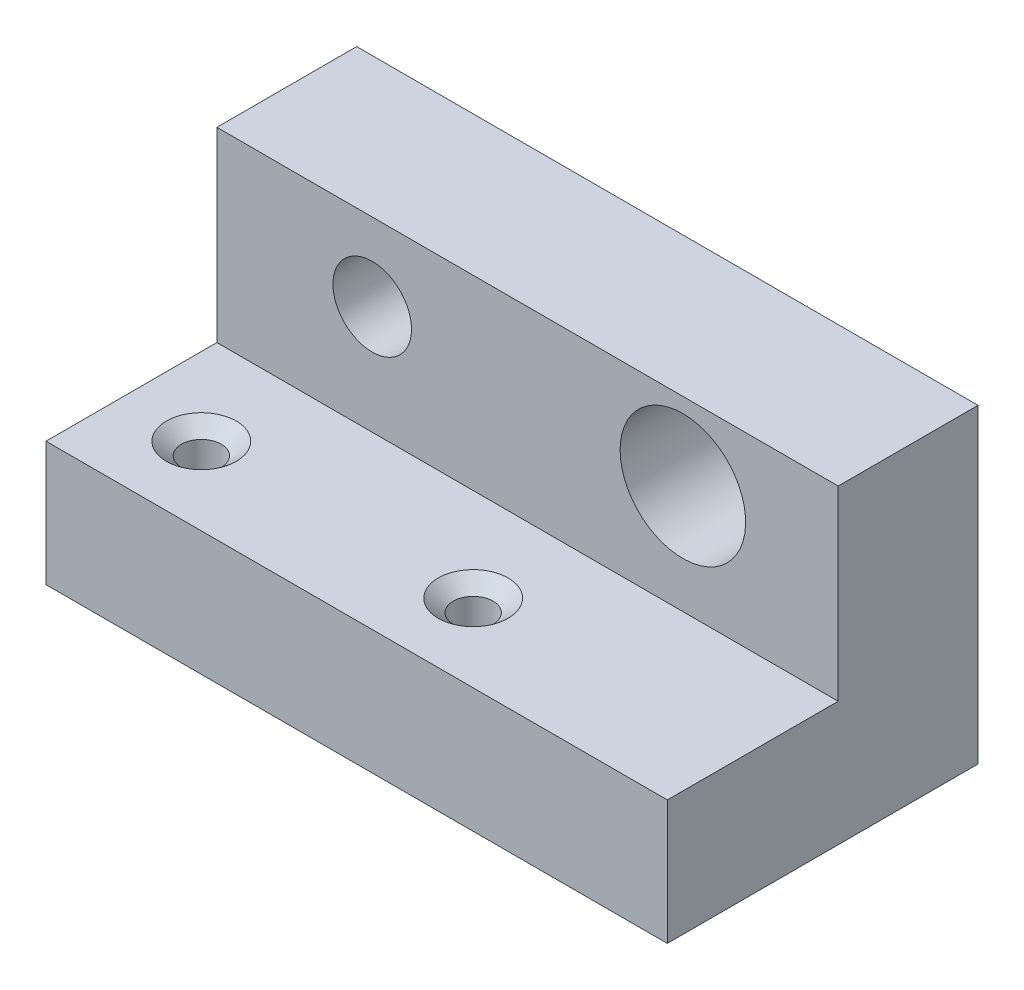
ISO-10303-21;
HEADER;
FILE_DESCRIPTION(('STEP AP214'),'2;1');
FILE_NAME('part.step','',(''),(''),'','','');
FILE_SCHEMA(('AUTOMOTIVE_DESIGN { 1 0 10303 214 1 1 1 1 }'));
ENDSEC;
DATA;
#1=APPLICATION_CONTEXT('core data for automotive mechanical design processes');
#2=APPLICATION_PROTOCOL_DEFINITION('international standard','automotive_design',2000,#1);
#3=PRODUCT_CONTEXT('',#1,'mechanical');
#4=PRODUCT('Part','Part','',(#3));
#5=PRODUCT_RELATED_PRODUCT_CATEGORY('part','',(#4));
#6=PRODUCT_DEFINITION_FORMATION('','',#4);
#7=PRODUCT_DEFINITION_CONTEXT('part definition',#1,'design');
#8=PRODUCT_DEFINITION('design','',#6,#7);
#9=PRODUCT_DEFINITION_SHAPE('','',#8);
#10=(LENGTH_UNIT() NAMED_UNIT(*) SI_UNIT(.MILLI.,.METRE.));
#11=(NAMED_UNIT(*) PLANE_ANGLE_UNIT() SI_UNIT($,.RADIAN.));
#12=(NAMED_UNIT(*) SI_UNIT($,.STERADIAN.) SOLID_ANGLE_UNIT());
#13=UNCERTAINTY_MEASURE_WITH_UNIT(LENGTH_MEASURE(1.E-05),#10,'distance_accuracy_value','');
#14=(GEOMETRIC_REPRESENTATION_CONTEXT(3) GLOBAL_UNCERTAINTY_ASSIGNED_CONTEXT((#13)) GLOBAL_UNIT_ASSIGNED_CONTEXT((#10,
#11,#12)) REPRESENTATION_CONTEXT('',''));
#15=CARTESIAN_POINT('',(0.,0.,0.));
#16=DIRECTION('',(0.,0.,1.));
#17=DIRECTION('',(1.,0.,0.));
#18=AXIS2_PLACEMENT_3D('',#15,#16,#17);
#19=CARTESIAN_POINT('',(50.8,0.,-25.4));
#20=DIRECTION('',(0.,1.,0.));
#21=DIRECTION('',(0.,0.,1.));
#22=AXIS2_PLACEMENT_3D('',#19,#20,#21);
#23=PLANE('',#22);
#24=CARTESIAN_POINT('',(6.35,0.,-6.34999999999999));
#25=DIRECTION('',(0.,1.,0.));
#26=DIRECTION('',(0.,0.,1.));
#27=AXIS2_PLACEMENT_3D('',#24,#25,#26);
#28=CIRCLE('',#27,1.63195);
#29=CARTESIAN_POINT('',(6.35,0.,-4.71805));
#30=VERTEX_POINT('',#29);
#31=EDGE_CURVE('E165',#30,#30,#28,.T.);
#32=ORIENTED_EDGE('',*,*,#31,.T.);
#33=EDGE_LOOP('',(#32));
#34=FACE_BOUND('',#33,.T.);
#35=CARTESIAN_POINT('',(28.575,0.,-6.34999999999999));
#36=DIRECTION('',(0.,1.,0.));
#37=DIRECTION('',(0.,0.,1.));
#38=AXIS2_PLACEMENT_3D('',#35,#36,#37);
#39=CIRCLE('',#38,1.63195);
#40=CARTESIAN_POINT('',(28.575,0.,-4.71805));
#41=VERTEX_POINT('',#40);
#42=EDGE_CURVE('E168',#41,#41,#39,.T.);
#43=ORIENTED_EDGE('',*,*,#42,.T.);
#44=EDGE_LOOP('',(#43));
#45=FACE_BOUND('',#44,.T.);
#46=DIRECTION('',(0.,0.,-1.));
#47=VECTOR('',#46,1.);
#48=CARTESIAN_POINT('',(0.,0.,-25.4));
#49=LINE('',#48,#47);
#50=CARTESIAN_POINT('',(0.,0.,0.));
#51=VERTEX_POINT('',#50);
#52=CARTESIAN_POINT('',(0.,0.,-25.4));
#53=VERTEX_POINT('',#52);
#54=EDGE_CURVE('E120',#51,#53,#49,.T.);
#55=ORIENTED_EDGE('',*,*,#54,.T.);
#56=DIRECTION('',(-1.,0.,0.));
#57=VECTOR('',#56,1.);
#58=CARTESIAN_POINT('',(50.8,0.,-25.4));
#59=LINE('',#58,#57);
#60=CARTESIAN_POINT('',(50.8,0.,-25.4));
#61=VERTEX_POINT('',#60);
#62=EDGE_CURVE('E11',#61,#53,#59,.T.);
#63=ORIENTED_EDGE('',*,*,#62,.F.);
#64=DIRECTION('',(0.,0.,-1.));
#65=VECTOR('',#64,1.);
#66=CARTESIAN_POINT('',(50.8,0.,-25.4));
#67=LINE('',#66,#65);
#68=CARTESIAN_POINT('',(50.8,0.,0.));
#69=VERTEX_POINT('',#68);
#70=EDGE_CURVE('E131',#69,#61,#67,.T.);
#71=ORIENTED_EDGE('',*,*,#70,.F.);
#72=DIRECTION('',(-1.,0.,0.));
#73=VECTOR('',#72,1.);
#74=CARTESIAN_POINT('',(50.8,0.,0.));
#75=LINE('',#74,#73);
#76=EDGE_CURVE('E116',#69,#51,#75,.T.);
#77=ORIENTED_EDGE('',*,*,#76,.T.);
#78=EDGE_LOOP('',(#55,#63,#71,#77));
#79=FACE_BOUND('',#78,.T.);
#80=ADVANCED_FACE('F36',(#34,#45,#79),#23,.F.);
#81=CARTESIAN_POINT('',(50.8,25.4,-25.4));
#82=DIRECTION('',(0.,0.,1.));
#83=DIRECTION('',(0.,-1.,0.));
#84=AXIS2_PLACEMENT_3D('',#81,#82,#83);
#85=PLANE('',#84);
#86=CARTESIAN_POINT('',(38.1,19.05,-25.4));
#87=DIRECTION('',(0.,0.,-1.));
#88=DIRECTION('',(0.,1.,0.));
#89=AXIS2_PLACEMENT_3D('',#86,#87,#88);
#90=CIRCLE('',#89,5.1308);
#91=CARTESIAN_POINT('',(38.1,24.1808,-25.4));
#92=VERTEX_POINT('',#91);
#93=EDGE_CURVE('E205',#92,#92,#90,.T.);
#94=ORIENTED_EDGE('',*,*,#93,.F.);
#95=EDGE_LOOP('',(#94));
#96=FACE_BOUND('',#95,.T.);
#97=CARTESIAN_POINT('',(12.7,19.05,-25.4));
#98=DIRECTION('',(0.,0.,1.));
#99=DIRECTION('',(1.,0.,0.));
#100=AXIS2_PLACEMENT_3D('',#97,#98,#99);
#101=CIRCLE('',#100,3.2131);
#102=CARTESIAN_POINT('',(15.9131,19.05,-25.4));
#103=VERTEX_POINT('',#102);
#104=EDGE_CURVE('E124',#103,#103,#101,.T.);
#105=ORIENTED_EDGE('',*,*,#104,.T.);
#106=EDGE_LOOP('',(#105));
#107=FACE_BOUND('',#106,.T.);
#108=DIRECTION('',(0.,1.,0.));
#109=VECTOR('',#108,1.);
#110=CARTESIAN_POINT('',(0.,25.4,-25.4));
#111=LINE('',#110,#109);
#112=CARTESIAN_POINT('',(0.,25.4,-25.4));
#113=VERTEX_POINT('',#112);
#114=EDGE_CURVE('E123',#53,#113,#111,.T.);
#115=ORIENTED_EDGE('',*,*,#114,.T.);
#116=DIRECTION('',(-1.,0.,0.));
#117=VECTOR('',#116,1.);
#118=CARTESIAN_POINT('',(50.8,25.4,-25.4));
#119=LINE('',#118,#117);
#120=CARTESIAN_POINT('',(50.8,25.4,-25.4));
#121=VERTEX_POINT('',#120);
#122=EDGE_CURVE('E44',#121,#113,#119,.T.);
#123=ORIENTED_EDGE('',*,*,#122,.F.);
#124=DIRECTION('',(0.,1.,0.));
#125=VECTOR('',#124,1.);
#126=CARTESIAN_POINT('',(50.8,25.4,-25.4));
#127=LINE('',#126,#125);
#128=EDGE_CURVE('E89',#61,#121,#127,.T.);
#129=ORIENTED_EDGE('',*,*,#128,.F.);
#130=ORIENTED_EDGE('',*,*,#62,.T.);
#131=EDGE_LOOP('',(#115,#123,#129,#130));
#132=FACE_BOUND('',#131,.T.);
#133=ADVANCED_FACE('F156',(#96,#107,#132),#85,.F.);
#134=CARTESIAN_POINT('',(50.8,25.4,-13.97));
#135=DIRECTION('',(0.,-1.,0.));
#136=DIRECTION('',(0.,0.,-1.));
#137=AXIS2_PLACEMENT_3D('',#134,#135,#136);
#138=PLANE('',#137);
#139=DIRECTION('',(0.,0.,1.));
#140=VECTOR('',#139,1.);
#141=CARTESIAN_POINT('',(0.,25.4,-13.97));
#142=LINE('',#141,#140);
#143=CARTESIAN_POINT('',(0.,25.4,-13.97));
#144=VERTEX_POINT('',#143);
#145=EDGE_CURVE('E126',#113,#144,#142,.T.);
#146=ORIENTED_EDGE('',*,*,#145,.T.);
#147=DIRECTION('',(-1.,0.,0.));
#148=VECTOR('',#147,1.);
#149=CARTESIAN_POINT('',(50.8,25.4,-13.97));
#150=LINE('',#149,#148);
#151=CARTESIAN_POINT('',(50.8,25.4,-13.97));
#152=VERTEX_POINT('',#151);
#153=EDGE_CURVE('E111',#152,#144,#150,.T.);
#154=ORIENTED_EDGE('',*,*,#153,.F.);
#155=DIRECTION('',(0.,0.,1.));
#156=VECTOR('',#155,1.);
#157=CARTESIAN_POINT('',(50.8,25.4,-13.97));
#158=LINE('',#157,#156);
#159=EDGE_CURVE('E102',#121,#152,#158,.T.);
#160=ORIENTED_EDGE('',*,*,#159,.F.);
#161=ORIENTED_EDGE('',*,*,#122,.T.);
#162=EDGE_LOOP('',(#146,#154,#160,#161));
#163=FACE_BOUND('',#162,.T.);
#164=ADVANCED_FACE('F137',(#163),#138,.F.);
#165=CARTESIAN_POINT('',(50.8,10.16,-13.97));
#166=DIRECTION('',(0.,0.,-1.));
#167=DIRECTION('',(-1.,0.,0.));
#168=AXIS2_PLACEMENT_3D('',#165,#166,#167);
#169=PLANE('',#168);
#170=CARTESIAN_POINT('',(38.1,19.05,-13.97));
#171=DIRECTION('',(0.,0.,-1.));
#172=DIRECTION('',(-1.,0.,0.));
#173=AXIS2_PLACEMENT_3D('',#170,#171,#172);
#174=CIRCLE('',#173,5.1308);
#175=CARTESIAN_POINT('',(32.9692,19.05,-13.97));
#176=VERTEX_POINT('',#175);
#177=EDGE_CURVE('E202',#176,#176,#174,.T.);
#178=ORIENTED_EDGE('',*,*,#177,.T.);
#179=EDGE_LOOP('',(#178));
#180=FACE_BOUND('',#179,.T.);
#181=CARTESIAN_POINT('',(12.7,19.05,-13.97));
#182=DIRECTION('',(0.,0.,1.));
#183=DIRECTION('',(1.,0.,0.));
#184=AXIS2_PLACEMENT_3D('',#181,#182,#183);
#185=CIRCLE('',#184,3.2131);
#186=CARTESIAN_POINT('',(15.9131,19.05,-13.97));
#187=VERTEX_POINT('',#186);
#188=EDGE_CURVE('E170',#187,#187,#185,.T.);
#189=ORIENTED_EDGE('',*,*,#188,.F.);
#190=EDGE_LOOP('',(#189));
#191=FACE_BOUND('',#190,.T.);
#192=DIRECTION('',(0.,-1.,0.));
#193=VECTOR('',#192,1.);
#194=CARTESIAN_POINT('',(0.,10.16,-13.97));
#195=LINE('',#194,#193);
#196=CARTESIAN_POINT('',(0.,10.16,-13.97));
#197=VERTEX_POINT('',#196);
#198=EDGE_CURVE('E110',#144,#197,#195,.T.);
#199=ORIENTED_EDGE('',*,*,#198,.T.);
#200=DIRECTION('',(-1.,0.,0.));
#201=VECTOR('',#200,1.);
#202=CARTESIAN_POINT('',(50.8,10.16,-13.97));
#203=LINE('',#202,#201);
#204=CARTESIAN_POINT('',(50.8,10.16,-13.97));
#205=VERTEX_POINT('',#204);
#206=EDGE_CURVE('E107',#205,#197,#203,.T.);
#207=ORIENTED_EDGE('',*,*,#206,.F.);
#208=DIRECTION('',(0.,-1.,0.));
#209=VECTOR('',#208,1.);
#210=CARTESIAN_POINT('',(50.8,10.16,-13.97));
#211=LINE('',#210,#209);
#212=EDGE_CURVE('E96',#152,#205,#211,.T.);
#213=ORIENTED_EDGE('',*,*,#212,.F.);
#214=ORIENTED_EDGE('',*,*,#153,.T.);
#215=EDGE_LOOP('',(#199,#207,#213,#214));
#216=FACE_BOUND('',#215,.T.);
#217=ADVANCED_FACE('F108',(#180,#191,#216),#169,.F.);
#218=CARTESIAN_POINT('',(50.8,10.16,0.));
#219=DIRECTION('',(0.,-1.,0.));
#220=DIRECTION('',(0.,0.,-1.));
#221=AXIS2_PLACEMENT_3D('',#218,#219,#220);
#222=PLANE('',#221);
#223=CARTESIAN_POINT('',(6.35,10.16,-6.34999999999999));
#224=DIRECTION('',(0.,1.,0.));
#225=DIRECTION('',(0.,0.,1.));
#226=AXIS2_PLACEMENT_3D('',#223,#224,#225);
#227=CIRCLE('',#226,2.8575);
#228=CARTESIAN_POINT('',(6.35,10.16,-3.4925));
#229=VERTEX_POINT('',#228);
#230=EDGE_CURVE('E204',#229,#229,#227,.T.);
#231=ORIENTED_EDGE('',*,*,#230,.F.);
#232=EDGE_LOOP('',(#231));
#233=FACE_BOUND('',#232,.T.);
#234=CARTESIAN_POINT('',(28.575,10.16,-6.34999999999999));
#235=DIRECTION('',(0.,1.,0.));
#236=DIRECTION('',(0.,0.,1.));
#237=AXIS2_PLACEMENT_3D('',#234,#235,#236);
#238=CIRCLE('',#237,2.8575);
#239=CARTESIAN_POINT('',(28.575,10.16,-3.4925));
#240=VERTEX_POINT('',#239);
#241=EDGE_CURVE('E176',#240,#240,#238,.T.);
#242=ORIENTED_EDGE('',*,*,#241,.F.);
#243=EDGE_LOOP('',(#242));
#244=FACE_BOUND('',#243,.T.);
#245=DIRECTION('',(0.,0.,1.));
#246=VECTOR('',#245,1.);
#247=CARTESIAN_POINT('',(0.,10.16,0.));
#248=LINE('',#247,#246);
#249=CARTESIAN_POINT('',(0.,10.16,0.));
#250=VERTEX_POINT('',#249);
#251=EDGE_CURVE('E75',#197,#250,#248,.T.);
#252=ORIENTED_EDGE('',*,*,#251,.T.);
#253=DIRECTION('',(-1.,0.,0.));
#254=VECTOR('',#253,1.);
#255=CARTESIAN_POINT('',(50.8,10.16,0.));
#256=LINE('',#255,#254);
#257=CARTESIAN_POINT('',(50.8,10.16,0.));
#258=VERTEX_POINT('',#257);
#259=EDGE_CURVE('E112',#258,#250,#256,.T.);
#260=ORIENTED_EDGE('',*,*,#259,.F.);
#261=DIRECTION('',(0.,0.,1.));
#262=VECTOR('',#261,1.);
#263=CARTESIAN_POINT('',(50.8,10.16,0.));
#264=LINE('',#263,#262);
#265=EDGE_CURVE('E100',#205,#258,#264,.T.);
#266=ORIENTED_EDGE('',*,*,#265,.F.);
#267=ORIENTED_EDGE('',*,*,#206,.T.);
#268=EDGE_LOOP('',(#252,#260,#266,#267));
#269=FACE_BOUND('',#268,.T.);
#270=ADVANCED_FACE('F114',(#233,#244,#269),#222,.F.);
#271=CARTESIAN_POINT('',(50.8,0.,0.));
#272=DIRECTION('',(0.,0.,-1.));
#273=DIRECTION('',(-1.,0.,0.));
#274=AXIS2_PLACEMENT_3D('',#271,#272,#273);
#275=PLANE('',#274);
#276=DIRECTION('',(0.,-1.,0.));
#277=VECTOR('',#276,1.);
#278=CARTESIAN_POINT('',(0.,0.,0.));
#279=LINE('',#278,#277);
#280=EDGE_CURVE('E81',#250,#51,#279,.T.);
#281=ORIENTED_EDGE('',*,*,#280,.T.);
#282=ORIENTED_EDGE('',*,*,#76,.F.);
#283=DIRECTION('',(0.,-1.,0.));
#284=VECTOR('',#283,1.);
#285=CARTESIAN_POINT('',(50.8,0.,0.));
#286=LINE('',#285,#284);
#287=EDGE_CURVE('E52',#258,#69,#286,.T.);
#288=ORIENTED_EDGE('',*,*,#287,.F.);
#289=ORIENTED_EDGE('',*,*,#259,.T.);
#290=EDGE_LOOP('',(#281,#282,#288,#289));
#291=FACE_BOUND('',#290,.T.);
#292=ADVANCED_FACE('F144',(#291),#275,.F.);
#293=CARTESIAN_POINT('',(50.8,0.,0.));
#294=DIRECTION('',(-1.,0.,0.));
#295=DIRECTION('',(0.,0.,1.));
#296=AXIS2_PLACEMENT_3D('',#293,#294,#295);
#297=PLANE('',#296);
#298=ORIENTED_EDGE('',*,*,#70,.T.);
#299=ORIENTED_EDGE('',*,*,#128,.T.);
#300=ORIENTED_EDGE('',*,*,#159,.T.);
#301=ORIENTED_EDGE('',*,*,#212,.T.);
#302=ORIENTED_EDGE('',*,*,#265,.T.);
#303=ORIENTED_EDGE('',*,*,#287,.T.);
#304=EDGE_LOOP('',(#298,#299,#300,#301,#302,#303));
#305=FACE_BOUND('',#304,.T.);
#306=ADVANCED_FACE('F98',(#305),#297,.F.);
#307=CARTESIAN_POINT('',(0.,0.,0.));
#308=DIRECTION('',(-1.,0.,0.));
#309=DIRECTION('',(0.,0.,1.));
#310=AXIS2_PLACEMENT_3D('',#307,#308,#309);
#311=PLANE('',#310);
#312=ORIENTED_EDGE('',*,*,#54,.F.);
#313=ORIENTED_EDGE('',*,*,#280,.F.);
#314=ORIENTED_EDGE('',*,*,#251,.F.);
#315=ORIENTED_EDGE('',*,*,#198,.F.);
#316=ORIENTED_EDGE('',*,*,#145,.F.);
#317=ORIENTED_EDGE('',*,*,#114,.F.);
#318=EDGE_LOOP('',(#312,#313,#314,#315,#316,#317));
#319=FACE_BOUND('',#318,.T.);
#320=ADVANCED_FACE('F140',(#319),#311,.T.);
#321=CARTESIAN_POINT('',(12.7,19.05,-25.4));
#322=DIRECTION('',(0.,0.,1.));
#323=DIRECTION('',(1.,0.,0.));
#324=AXIS2_PLACEMENT_3D('',#321,#322,#323);
#325=CYLINDRICAL_SURFACE('',#324,3.2131);
#326=CARTESIAN_POINT('',(15.9131,19.05,-25.4));
#327=CARTESIAN_POINT('',(15.9131,19.05,-25.2809375));
#328=CARTESIAN_POINT('',(15.9131,19.05,-25.161875));
#329=CARTESIAN_POINT('',(15.9131,19.05,-24.92375));
#330=CARTESIAN_POINT('',(15.9131,19.05,-24.8046875));
#331=CARTESIAN_POINT('',(15.9131,19.05,-24.5665625));
#332=CARTESIAN_POINT('',(15.9131,19.05,-24.4475));
#333=CARTESIAN_POINT('',(15.9131,19.05,-24.209375));
#334=CARTESIAN_POINT('',(15.9131,19.05,-24.0903125));
#335=CARTESIAN_POINT('',(15.9131,19.05,-23.8521875));
#336=CARTESIAN_POINT('',(15.9131,19.05,-23.733125));
#337=CARTESIAN_POINT('',(15.9131,19.05,-23.495));
#338=CARTESIAN_POINT('',(15.9131,19.05,-23.3759375));
#339=CARTESIAN_POINT('',(15.9131,19.05,-23.1378125));
#340=CARTESIAN_POINT('',(15.9131,19.05,-23.01875));
#341=CARTESIAN_POINT('',(15.9131,19.05,-22.780625));
#342=CARTESIAN_POINT('',(15.9131,19.05,-22.6615625));
#343=CARTESIAN_POINT('',(15.9131,19.05,-22.4234375));
#344=CARTESIAN_POINT('',(15.9131,19.05,-22.304375));
#345=CARTESIAN_POINT('',(15.9131,19.05,-22.06625));
#346=CARTESIAN_POINT('',(15.9131,19.05,-21.9471875));
#347=CARTESIAN_POINT('',(15.9131,19.05,-21.7090625));
#348=CARTESIAN_POINT('',(15.9131,19.05,-21.59));
#349=CARTESIAN_POINT('',(15.9131,19.05,-21.351875));
#350=CARTESIAN_POINT('',(15.9131,19.05,-21.2328125));
#351=CARTESIAN_POINT('',(15.9131,19.05,-20.9946875));
#352=CARTESIAN_POINT('',(15.9131,19.05,-20.875625));
#353=CARTESIAN_POINT('',(15.9131,19.05,-20.6375));
#354=CARTESIAN_POINT('',(15.9131,19.05,-20.5184375));
#355=CARTESIAN_POINT('',(15.9131,19.05,-20.2803125));
#356=CARTESIAN_POINT('',(15.9131,19.05,-20.16125));
#357=CARTESIAN_POINT('',(15.9131,19.05,-19.923125));
#358=CARTESIAN_POINT('',(15.9131,19.05,-19.8040625));
#359=CARTESIAN_POINT('',(15.9131,19.05,-19.5659375));
#360=CARTESIAN_POINT('',(15.9131,19.05,-19.446875));
#361=CARTESIAN_POINT('',(15.9131,19.05,-19.20875));
#362=CARTESIAN_POINT('',(15.9131,19.05,-19.0896875));
#363=CARTESIAN_POINT('',(15.9131,19.05,-18.8515625));
#364=CARTESIAN_POINT('',(15.9131,19.05,-18.7325));
#365=CARTESIAN_POINT('',(15.9131,19.05,-18.494375));
#366=CARTESIAN_POINT('',(15.9131,19.05,-18.3753125));
#367=CARTESIAN_POINT('',(15.9131,19.05,-18.1371875));
#368=CARTESIAN_POINT('',(15.9131,19.05,-18.018125));
#369=CARTESIAN_POINT('',(15.9131,19.05,-17.78));
#370=CARTESIAN_POINT('',(15.9131,19.05,-17.6609375));
#371=CARTESIAN_POINT('',(15.9131,19.05,-17.4228125));
#372=CARTESIAN_POINT('',(15.9131,19.05,-17.30375));
#373=CARTESIAN_POINT('',(15.9131,19.05,-17.065625));
#374=CARTESIAN_POINT('',(15.9131,19.05,-16.9465625));
#375=CARTESIAN_POINT('',(15.9131,19.05,-16.7084375));
#376=CARTESIAN_POINT('',(15.9131,19.05,-16.589375));
#377=CARTESIAN_POINT('',(15.9131,19.05,-16.35125));
#378=CARTESIAN_POINT('',(15.9131,19.05,-16.2321875));
#379=CARTESIAN_POINT('',(15.9131,19.05,-15.9940625));
#380=CARTESIAN_POINT('',(15.9131,19.05,-15.875));
#381=CARTESIAN_POINT('',(15.9131,19.05,-15.636875));
#382=CARTESIAN_POINT('',(15.9131,19.05,-15.5178125));
#383=CARTESIAN_POINT('',(15.9131,19.05,-15.2796875));
#384=CARTESIAN_POINT('',(15.9131,19.05,-15.160625));
#385=CARTESIAN_POINT('',(15.9131,19.05,-14.9225));
#386=CARTESIAN_POINT('',(15.9131,19.05,-14.8034375));
#387=CARTESIAN_POINT('',(15.9131,19.05,-14.5653125));
#388=CARTESIAN_POINT('',(15.9131,19.05,-14.44625));
#389=CARTESIAN_POINT('',(15.9131,19.05,-14.208125));
#390=CARTESIAN_POINT('',(15.9131,19.05,-14.0890625));
#391=CARTESIAN_POINT('',(15.9131,19.05,-13.97));
#392=B_SPLINE_CURVE_WITH_KNOTS('',3,(#326,#327,#328,#329,#330,#331,#332,#333,#334,#335,#336,
#337,#338,#339,#340,#341,#342,#343,#344,#345,#346,#347,#348,#349,#350,#351,#352,#353,#354,#355,
#356,#357,#358,#359,#360,#361,#362,#363,#364,#365,#366,#367,#368,#369,#370,#371,#372,#373,#374,
#375,#376,#377,#378,#379,#380,#381,#382,#383,#384,#385,#386,#387,#388,#389,#390,#391),
.UNSPECIFIED.,.F.,.F.,(4,2,2,2,2,2,2,2,2,2,2,2,2,2,2,2,2,2,2,2,2,2,2,2,2,2,2,2,2,2,2,2,4),(0.,
0.357187500000002,0.714375000000003,1.0715625,1.42875,1.7859375,2.14312500000001,
2.50031250000001,2.85750000000001,3.21468750000001,3.57187500000001,3.92906250000001,
4.28625000000001,4.64343750000001,5.00062500000001,5.35781250000001,5.71500000000001,
6.07218750000001,6.42937500000001,6.78656250000002,7.14375000000001,7.50093750000002,
7.85812500000002,8.21531250000002,8.57250000000002,8.92968750000002,9.28687500000002,
9.64406250000002,10.00125,10.3584375,10.715625,11.0728125,11.43),.UNSPECIFIED.);
#393=EDGE_CURVE('BSEAM186',#103,#187,#392,.T.);
#394=ORIENTED_EDGE('',*,*,#104,.F.);
#395=ORIENTED_EDGE('',*,*,#188,.T.);
#396=ORIENTED_EDGE('',*,*,#393,.T.);
#397=ORIENTED_EDGE('',*,*,#393,.F.);
#398=EDGE_LOOP('',(#394,#396,#395,#397));
#399=FACE_BOUND('',#398,.T.);
#400=ADVANCED_FACE('F186',(#399),#325,.F.);
#401=CARTESIAN_POINT('',(28.575,10.16,-6.34999999999999));
#402=DIRECTION('',(0.,1.,0.));
#403=DIRECTION('',(0.,0.,1.));
#404=AXIS2_PLACEMENT_3D('',#401,#402,#403);
#405=CYLINDRICAL_SURFACE('',#404,1.63195);
#406=ORIENTED_EDGE('',*,*,#42,.F.);
#407=EDGE_LOOP('',(#406));
#408=FACE_BOUND('',#407,.T.);
#409=CARTESIAN_POINT('',(28.575,9.13164144701069,-6.34999999999999));
#410=DIRECTION('',(0.,1.,0.));
#411=DIRECTION('',(0.,0.,1.));
#412=AXIS2_PLACEMENT_3D('',#409,#410,#411);
#413=CIRCLE('',#412,1.63195);
#414=CARTESIAN_POINT('',(28.575,9.13164144701069,-4.71804999999999));
#415=VERTEX_POINT('',#414);
#416=EDGE_CURVE('E171',#415,#415,#413,.T.);
#417=ORIENTED_EDGE('',*,*,#416,.T.);
#418=EDGE_LOOP('',(#417));
#419=FACE_BOUND('',#418,.T.);
#420=ADVANCED_FACE('F189',(#408,#419),#405,.F.);
#421=CARTESIAN_POINT('',(28.575,10.16,-6.34999999999999));
#422=DIRECTION('',(0.,1.,0.));
#423=DIRECTION('',(0.,0.,1.));
#424=AXIS2_PLACEMENT_3D('',#421,#422,#423);
#425=CONICAL_SURFACE('',#424,2.8575,0.872664625997163);
#426=ORIENTED_EDGE('',*,*,#416,.F.);
#427=EDGE_LOOP('',(#426));
#428=FACE_BOUND('',#427,.T.);
#429=ORIENTED_EDGE('',*,*,#241,.T.);
#430=EDGE_LOOP('',(#429));
#431=FACE_BOUND('',#430,.T.);
#432=ADVANCED_FACE('F218',(#428,#431),#425,.F.);
#433=CARTESIAN_POINT('',(6.35,10.16,-6.34999999999999));
#434=DIRECTION('',(0.,1.,0.));
#435=DIRECTION('',(0.,0.,1.));
#436=AXIS2_PLACEMENT_3D('',#433,#434,#435);
#437=CYLINDRICAL_SURFACE('',#436,1.63195);
#438=ORIENTED_EDGE('',*,*,#31,.F.);
#439=EDGE_LOOP('',(#438));
#440=FACE_BOUND('',#439,.T.);
#441=CARTESIAN_POINT('',(6.35,9.13164144701069,-6.34999999999999));
#442=DIRECTION('',(0.,1.,0.));
#443=DIRECTION('',(0.,0.,1.));
#444=AXIS2_PLACEMENT_3D('',#441,#442,#443);
#445=CIRCLE('',#444,1.63195);
#446=CARTESIAN_POINT('',(6.35,9.13164144701069,-4.71805));
#447=VERTEX_POINT('',#446);
#448=EDGE_CURVE('E208',#447,#447,#445,.T.);
#449=ORIENTED_EDGE('',*,*,#448,.T.);
#450=EDGE_LOOP('',(#449));
#451=FACE_BOUND('',#450,.T.);
#452=ADVANCED_FACE('F221',(#440,#451),#437,.F.);
#453=CARTESIAN_POINT('',(6.35,10.16,-6.34999999999999));
#454=DIRECTION('',(0.,1.,0.));
#455=DIRECTION('',(0.,0.,1.));
#456=AXIS2_PLACEMENT_3D('',#453,#454,#455);
#457=CONICAL_SURFACE('',#456,2.8575,0.872664625997163);
#458=ORIENTED_EDGE('',*,*,#448,.F.);
#459=EDGE_LOOP('',(#458));
#460=FACE_BOUND('',#459,.T.);
#461=ORIENTED_EDGE('',*,*,#230,.T.);
#462=EDGE_LOOP('',(#461));
#463=FACE_BOUND('',#462,.T.);
#464=ADVANCED_FACE('F228',(#460,#463),#457,.F.);
#465=CARTESIAN_POINT('',(38.1,19.05,-25.4));
#466=DIRECTION('',(0.,0.,-1.));
#467=DIRECTION('',(0.,1.,0.));
#468=AXIS2_PLACEMENT_3D('',#465,#466,#467);
#469=CYLINDRICAL_SURFACE('',#468,5.1308);
#470=ORIENTED_EDGE('',*,*,#93,.T.);
#471=EDGE_LOOP('',(#470));
#472=FACE_BOUND('',#471,.T.);
#473=ORIENTED_EDGE('',*,*,#177,.F.);
#474=EDGE_LOOP('',(#473));
#475=FACE_BOUND('',#474,.T.);
#476=ADVANCED_FACE('F266',(#472,#475),#469,.F.);
#477=CLOSED_SHELL('',(#80,#133,#164,#217,#270,#292,#306,#320,#400,#420,#432,#452,#464,#476));
#478=MANIFOLD_SOLID_BREP('B2',#477);
#479=ADVANCED_BREP_SHAPE_REPRESENTATION('',(#18,#478),#14);
#480=SHAPE_DEFINITION_REPRESENTATION(#9,#479);
ENDSEC;
END-ISO-10303-21;
